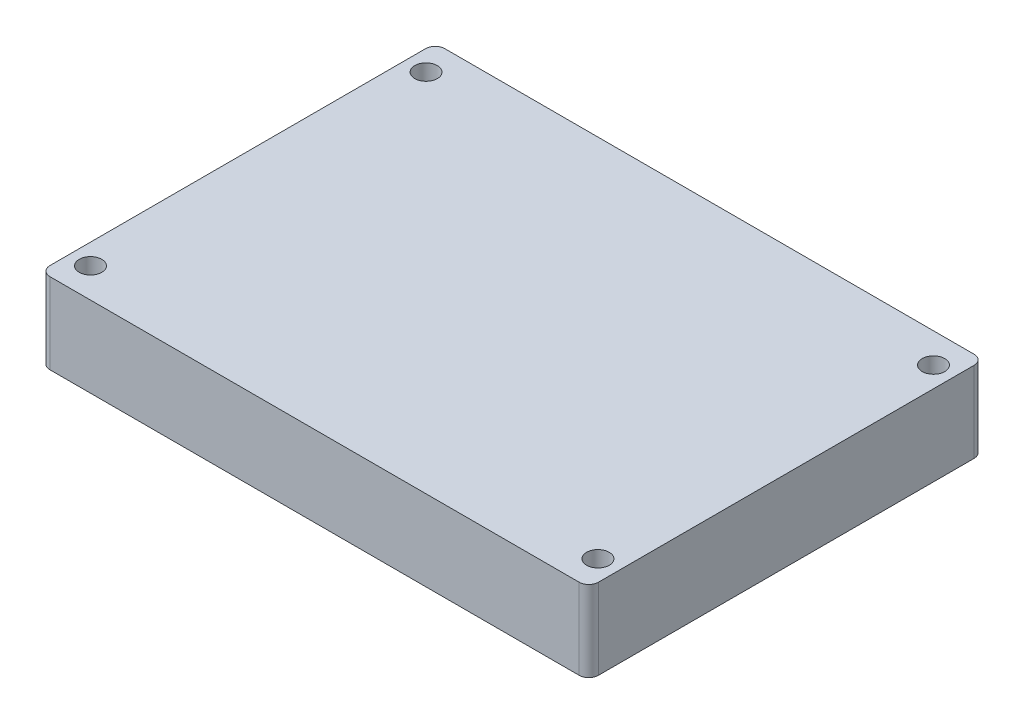
ISO-10303-21;
HEADER;
FILE_DESCRIPTION(('STEP AP214'),'2;1');
FILE_NAME('part.step','',(''),(''),'','','');
FILE_SCHEMA(('AUTOMOTIVE_DESIGN { 1 0 10303 214 1 1 1 1 }'));
ENDSEC;
DATA;
#1=APPLICATION_CONTEXT('core data for automotive mechanical design processes');
#2=APPLICATION_PROTOCOL_DEFINITION('international standard','automotive_design',2000,#1);
#3=PRODUCT_CONTEXT('',#1,'mechanical');
#4=PRODUCT('Part','Part','',(#3));
#5=PRODUCT_RELATED_PRODUCT_CATEGORY('part','',(#4));
#6=PRODUCT_DEFINITION_FORMATION('','',#4);
#7=PRODUCT_DEFINITION_CONTEXT('part definition',#1,'design');
#8=PRODUCT_DEFINITION('design','',#6,#7);
#9=PRODUCT_DEFINITION_SHAPE('','',#8);
#10=(LENGTH_UNIT() NAMED_UNIT(*) SI_UNIT(.MILLI.,.METRE.));
#11=(NAMED_UNIT(*) PLANE_ANGLE_UNIT() SI_UNIT($,.RADIAN.));
#12=(NAMED_UNIT(*) SI_UNIT($,.STERADIAN.) SOLID_ANGLE_UNIT());
#13=UNCERTAINTY_MEASURE_WITH_UNIT(LENGTH_MEASURE(1.E-05),#10,'distance_accuracy_value','');
#14=(GEOMETRIC_REPRESENTATION_CONTEXT(3) GLOBAL_UNCERTAINTY_ASSIGNED_CONTEXT((#13)) GLOBAL_UNIT_ASSIGNED_CONTEXT((#10,
#11,#12)) REPRESENTATION_CONTEXT('',''));
#15=CARTESIAN_POINT('',(0.,0.,0.));
#16=DIRECTION('',(0.,0.,1.));
#17=DIRECTION('',(1.,0.,0.));
#18=AXIS2_PLACEMENT_3D('',#15,#16,#17);
#19=CARTESIAN_POINT('',(41.,12.5,29.1));
#20=DIRECTION('',(0.,1.,0.));
#21=DIRECTION('',(0.,0.,1.));
#22=AXIS2_PLACEMENT_3D('',#19,#20,#21);
#23=PLANE('',#22);
#24=CARTESIAN_POINT('',(39.32,12.5,26.));
#25=DIRECTION('',(0.,1.,0.));
#26=DIRECTION('',(0.,0.,-1.));
#27=AXIS2_PLACEMENT_3D('',#24,#25,#26);
#28=CIRCLE('',#27,1.75);
#29=CARTESIAN_POINT('',(39.32,12.5,24.25));
#30=VERTEX_POINT('',#29);
#31=EDGE_CURVE('E189',#30,#30,#28,.T.);
#32=ORIENTED_EDGE('',*,*,#31,.F.);
#33=EDGE_LOOP('',(#32));
#34=FACE_BOUND('',#33,.T.);
#35=CARTESIAN_POINT('',(39.32,12.5,-26.));
#36=DIRECTION('',(0.,1.,0.));
#37=DIRECTION('',(0.,0.,1.));
#38=AXIS2_PLACEMENT_3D('',#35,#36,#37);
#39=CIRCLE('',#38,1.75);
#40=CARTESIAN_POINT('',(39.32,12.5,-24.25));
#41=VERTEX_POINT('',#40);
#42=EDGE_CURVE('E135',#41,#41,#39,.T.);
#43=ORIENTED_EDGE('',*,*,#42,.F.);
#44=EDGE_LOOP('',(#43));
#45=FACE_BOUND('',#44,.T.);
#46=CARTESIAN_POINT('',(41.,12.5,29.1));
#47=DIRECTION('',(0.,1.,0.));
#48=DIRECTION('',(0.,0.,1.));
#49=AXIS2_PLACEMENT_3D('',#46,#47,#48);
#50=CIRCLE('',#49,1.5);
#51=CARTESIAN_POINT('',(41.,12.5,30.6));
#52=VERTEX_POINT('',#51);
#53=CARTESIAN_POINT('',(42.5,12.5,29.1));
#54=VERTEX_POINT('',#53);
#55=EDGE_CURVE('E146',#52,#54,#50,.T.);
#56=ORIENTED_EDGE('',*,*,#55,.T.);
#57=DIRECTION('',(0.,0.,-1.));
#58=VECTOR('',#57,1.);
#59=CARTESIAN_POINT('',(42.5,12.5,29.1));
#60=LINE('',#59,#58);
#61=CARTESIAN_POINT('',(42.5,12.5,-29.1));
#62=VERTEX_POINT('',#61);
#63=EDGE_CURVE('E94',#54,#62,#60,.T.);
#64=ORIENTED_EDGE('',*,*,#63,.T.);
#65=CARTESIAN_POINT('',(41.,12.5,-29.1));
#66=DIRECTION('',(0.,1.,0.));
#67=DIRECTION('',(0.,0.,1.));
#68=AXIS2_PLACEMENT_3D('',#65,#66,#67);
#69=CIRCLE('',#68,1.5);
#70=CARTESIAN_POINT('',(41.,12.5,-30.6));
#71=VERTEX_POINT('',#70);
#72=EDGE_CURVE('E161',#62,#71,#69,.T.);
#73=ORIENTED_EDGE('',*,*,#72,.T.);
#74=DIRECTION('',(-1.,0.,0.));
#75=VECTOR('',#74,1.);
#76=CARTESIAN_POINT('',(41.,12.5,-30.6));
#77=LINE('',#76,#75);
#78=CARTESIAN_POINT('',(-41.,12.5,-30.6));
#79=VERTEX_POINT('',#78);
#80=EDGE_CURVE('E174',#71,#79,#77,.T.);
#81=ORIENTED_EDGE('',*,*,#80,.T.);
#82=CARTESIAN_POINT('',(-41.,12.5,-29.1));
#83=DIRECTION('',(0.,1.,0.));
#84=DIRECTION('',(0.,0.,1.));
#85=AXIS2_PLACEMENT_3D('',#82,#83,#84);
#86=CIRCLE('',#85,1.5);
#87=CARTESIAN_POINT('',(-42.5,12.5,-29.1));
#88=VERTEX_POINT('',#87);
#89=EDGE_CURVE('E113',#79,#88,#86,.T.);
#90=ORIENTED_EDGE('',*,*,#89,.T.);
#91=DIRECTION('',(0.,0.,1.));
#92=VECTOR('',#91,1.);
#93=CARTESIAN_POINT('',(-42.5,12.5,29.1));
#94=LINE('',#93,#92);
#95=CARTESIAN_POINT('',(-42.5,12.5,29.1));
#96=VERTEX_POINT('',#95);
#97=EDGE_CURVE('E107',#88,#96,#94,.T.);
#98=ORIENTED_EDGE('',*,*,#97,.T.);
#99=CARTESIAN_POINT('',(-41.,12.5,29.1));
#100=DIRECTION('',(0.,1.,0.));
#101=DIRECTION('',(0.,0.,-1.));
#102=AXIS2_PLACEMENT_3D('',#99,#100,#101);
#103=CIRCLE('',#102,1.5);
#104=CARTESIAN_POINT('',(-41.,12.5,30.6));
#105=VERTEX_POINT('',#104);
#106=EDGE_CURVE('E111',#96,#105,#103,.T.);
#107=ORIENTED_EDGE('',*,*,#106,.T.);
#108=DIRECTION('',(1.,0.,0.));
#109=VECTOR('',#108,1.);
#110=CARTESIAN_POINT('',(41.,12.5,30.6));
#111=LINE('',#110,#109);
#112=EDGE_CURVE('E51',#105,#52,#111,.T.);
#113=ORIENTED_EDGE('',*,*,#112,.T.);
#114=EDGE_LOOP('',(#56,#64,#73,#81,#90,#98,#107,#113));
#115=FACE_BOUND('',#114,.T.);
#116=CARTESIAN_POINT('',(-39.32,12.5,26.));
#117=DIRECTION('',(0.,1.,0.));
#118=DIRECTION('',(0.,0.,1.));
#119=AXIS2_PLACEMENT_3D('',#116,#117,#118);
#120=CIRCLE('',#119,1.75);
#121=CARTESIAN_POINT('',(-39.32,12.5,27.75));
#122=VERTEX_POINT('',#121);
#123=EDGE_CURVE('E183',#122,#122,#120,.T.);
#124=ORIENTED_EDGE('',*,*,#123,.F.);
#125=EDGE_LOOP('',(#124));
#126=FACE_BOUND('',#125,.T.);
#127=CARTESIAN_POINT('',(-39.32,12.5,-26.));
#128=DIRECTION('',(0.,1.,0.));
#129=DIRECTION('',(0.,0.,-1.));
#130=AXIS2_PLACEMENT_3D('',#127,#128,#129);
#131=CIRCLE('',#130,1.75);
#132=CARTESIAN_POINT('',(-39.32,12.5,-27.75));
#133=VERTEX_POINT('',#132);
#134=EDGE_CURVE('E195',#133,#133,#131,.T.);
#135=ORIENTED_EDGE('',*,*,#134,.F.);
#136=EDGE_LOOP('',(#135));
#137=FACE_BOUND('',#136,.T.);
#138=ADVANCED_FACE('F34',(#34,#45,#115,#126,#137),#23,.T.);
#139=CARTESIAN_POINT('',(41.,0.,29.1));
#140=DIRECTION('',(0.,1.,0.));
#141=DIRECTION('',(0.,0.,1.));
#142=AXIS2_PLACEMENT_3D('',#139,#140,#141);
#143=PLANE('',#142);
#144=CARTESIAN_POINT('',(41.,0.,29.1));
#145=DIRECTION('',(0.,1.,0.));
#146=DIRECTION('',(0.,0.,1.));
#147=AXIS2_PLACEMENT_3D('',#144,#145,#146);
#148=CIRCLE('',#147,1.5);
#149=CARTESIAN_POINT('',(41.,0.,30.6));
#150=VERTEX_POINT('',#149);
#151=CARTESIAN_POINT('',(42.5,0.,29.1));
#152=VERTEX_POINT('',#151);
#153=EDGE_CURVE('E131',#150,#152,#148,.T.);
#154=ORIENTED_EDGE('',*,*,#153,.F.);
#155=DIRECTION('',(1.,0.,0.));
#156=VECTOR('',#155,1.);
#157=CARTESIAN_POINT('',(41.,0.,30.6));
#158=LINE('',#157,#156);
#159=CARTESIAN_POINT('',(-41.,0.,30.6));
#160=VERTEX_POINT('',#159);
#161=EDGE_CURVE('E86',#160,#150,#158,.T.);
#162=ORIENTED_EDGE('',*,*,#161,.F.);
#163=CARTESIAN_POINT('',(-41.,0.,29.1));
#164=DIRECTION('',(0.,1.,0.));
#165=DIRECTION('',(0.,0.,-1.));
#166=AXIS2_PLACEMENT_3D('',#163,#164,#165);
#167=CIRCLE('',#166,1.5);
#168=CARTESIAN_POINT('',(-42.5,0.,29.1));
#169=VERTEX_POINT('',#168);
#170=EDGE_CURVE('E80',#169,#160,#167,.T.);
#171=ORIENTED_EDGE('',*,*,#170,.F.);
#172=DIRECTION('',(0.,0.,1.));
#173=VECTOR('',#172,1.);
#174=CARTESIAN_POINT('',(-42.5,0.,29.1));
#175=LINE('',#174,#173);
#176=CARTESIAN_POINT('',(-42.5,0.,-29.1));
#177=VERTEX_POINT('',#176);
#178=EDGE_CURVE('E121',#177,#169,#175,.T.);
#179=ORIENTED_EDGE('',*,*,#178,.F.);
#180=CARTESIAN_POINT('',(-41.,0.,-29.1));
#181=DIRECTION('',(0.,1.,0.));
#182=DIRECTION('',(0.,0.,1.));
#183=AXIS2_PLACEMENT_3D('',#180,#181,#182);
#184=CIRCLE('',#183,1.5);
#185=CARTESIAN_POINT('',(-41.,0.,-30.6));
#186=VERTEX_POINT('',#185);
#187=EDGE_CURVE('E141',#186,#177,#184,.T.);
#188=ORIENTED_EDGE('',*,*,#187,.F.);
#189=DIRECTION('',(-1.,0.,0.));
#190=VECTOR('',#189,1.);
#191=CARTESIAN_POINT('',(41.,0.,-30.6));
#192=LINE('',#191,#190);
#193=CARTESIAN_POINT('',(41.,0.,-30.6));
#194=VERTEX_POINT('',#193);
#195=EDGE_CURVE('E139',#194,#186,#192,.T.);
#196=ORIENTED_EDGE('',*,*,#195,.F.);
#197=CARTESIAN_POINT('',(41.,0.,-29.1));
#198=DIRECTION('',(0.,1.,0.));
#199=DIRECTION('',(0.,0.,1.));
#200=AXIS2_PLACEMENT_3D('',#197,#198,#199);
#201=CIRCLE('',#200,1.5);
#202=CARTESIAN_POINT('',(42.5,0.,-29.1));
#203=VERTEX_POINT('',#202);
#204=EDGE_CURVE('E137',#203,#194,#201,.T.);
#205=ORIENTED_EDGE('',*,*,#204,.F.);
#206=DIRECTION('',(0.,0.,-1.));
#207=VECTOR('',#206,1.);
#208=CARTESIAN_POINT('',(42.5,0.,29.1));
#209=LINE('',#208,#207);
#210=EDGE_CURVE('E134',#152,#203,#209,.T.);
#211=ORIENTED_EDGE('',*,*,#210,.F.);
#212=EDGE_LOOP('',(#154,#162,#171,#179,#188,#196,#205,#211));
#213=FACE_BOUND('',#212,.T.);
#214=CARTESIAN_POINT('',(39.32,0.,-26.));
#215=DIRECTION('',(0.,1.,0.));
#216=DIRECTION('',(0.,0.,1.));
#217=AXIS2_PLACEMENT_3D('',#214,#215,#216);
#218=CIRCLE('',#217,1.75);
#219=CARTESIAN_POINT('',(39.32,0.,-24.25));
#220=VERTEX_POINT('',#219);
#221=EDGE_CURVE('E180',#220,#220,#218,.T.);
#222=ORIENTED_EDGE('',*,*,#221,.T.);
#223=EDGE_LOOP('',(#222));
#224=FACE_BOUND('',#223,.T.);
#225=CARTESIAN_POINT('',(-39.32,0.,26.));
#226=DIRECTION('',(0.,1.,0.));
#227=DIRECTION('',(0.,0.,1.));
#228=AXIS2_PLACEMENT_3D('',#225,#226,#227);
#229=CIRCLE('',#228,1.75);
#230=CARTESIAN_POINT('',(-39.32,0.,27.75));
#231=VERTEX_POINT('',#230);
#232=EDGE_CURVE('E186',#231,#231,#229,.T.);
#233=ORIENTED_EDGE('',*,*,#232,.T.);
#234=EDGE_LOOP('',(#233));
#235=FACE_BOUND('',#234,.T.);
#236=CARTESIAN_POINT('',(39.32,0.,26.));
#237=DIRECTION('',(0.,1.,0.));
#238=DIRECTION('',(0.,0.,-1.));
#239=AXIS2_PLACEMENT_3D('',#236,#237,#238);
#240=CIRCLE('',#239,1.75);
#241=CARTESIAN_POINT('',(39.32,0.,24.25));
#242=VERTEX_POINT('',#241);
#243=EDGE_CURVE('E192',#242,#242,#240,.T.);
#244=ORIENTED_EDGE('',*,*,#243,.T.);
#245=EDGE_LOOP('',(#244));
#246=FACE_BOUND('',#245,.T.);
#247=CARTESIAN_POINT('',(-39.32,0.,-26.));
#248=DIRECTION('',(0.,1.,0.));
#249=DIRECTION('',(0.,0.,-1.));
#250=AXIS2_PLACEMENT_3D('',#247,#248,#249);
#251=CIRCLE('',#250,1.75);
#252=CARTESIAN_POINT('',(-39.32,0.,-27.75));
#253=VERTEX_POINT('',#252);
#254=EDGE_CURVE('E198',#253,#253,#251,.T.);
#255=ORIENTED_EDGE('',*,*,#254,.T.);
#256=EDGE_LOOP('',(#255));
#257=FACE_BOUND('',#256,.T.);
#258=ADVANCED_FACE('F165',(#213,#224,#235,#246,#257),#143,.F.);
#259=CARTESIAN_POINT('',(41.,12.5,29.1));
#260=DIRECTION('',(0.,-1.,0.));
#261=DIRECTION('',(0.,0.,-1.));
#262=AXIS2_PLACEMENT_3D('',#259,#260,#261);
#263=CYLINDRICAL_SURFACE('',#262,1.5);
#264=ORIENTED_EDGE('',*,*,#153,.T.);
#265=DIRECTION('',(0.,-1.,0.));
#266=VECTOR('',#265,1.);
#267=CARTESIAN_POINT('',(42.5,12.5,29.1));
#268=LINE('',#267,#266);
#269=EDGE_CURVE('E11',#54,#152,#268,.T.);
#270=ORIENTED_EDGE('',*,*,#269,.F.);
#271=ORIENTED_EDGE('',*,*,#55,.F.);
#272=DIRECTION('',(0.,-1.,0.));
#273=VECTOR('',#272,1.);
#274=CARTESIAN_POINT('',(41.,12.5,30.6));
#275=LINE('',#274,#273);
#276=EDGE_CURVE('E127',#52,#150,#275,.T.);
#277=ORIENTED_EDGE('',*,*,#276,.T.);
#278=EDGE_LOOP('',(#264,#270,#271,#277));
#279=FACE_BOUND('',#278,.T.);
#280=ADVANCED_FACE('F36',(#279),#263,.T.);
#281=CARTESIAN_POINT('',(42.5,12.5,29.1));
#282=DIRECTION('',(-1.,0.,0.));
#283=DIRECTION('',(0.,0.,1.));
#284=AXIS2_PLACEMENT_3D('',#281,#282,#283);
#285=PLANE('',#284);
#286=ORIENTED_EDGE('',*,*,#210,.T.);
#287=DIRECTION('',(0.,-1.,0.));
#288=VECTOR('',#287,1.);
#289=CARTESIAN_POINT('',(42.5,12.5,-29.1));
#290=LINE('',#289,#288);
#291=EDGE_CURVE('E43',#62,#203,#290,.T.);
#292=ORIENTED_EDGE('',*,*,#291,.F.);
#293=ORIENTED_EDGE('',*,*,#63,.F.);
#294=ORIENTED_EDGE('',*,*,#269,.T.);
#295=EDGE_LOOP('',(#286,#292,#293,#294));
#296=FACE_BOUND('',#295,.T.);
#297=ADVANCED_FACE('F232',(#296),#285,.F.);
#298=CARTESIAN_POINT('',(41.,12.5,-29.1));
#299=DIRECTION('',(0.,-1.,0.));
#300=DIRECTION('',(0.,0.,-1.));
#301=AXIS2_PLACEMENT_3D('',#298,#299,#300);
#302=CYLINDRICAL_SURFACE('',#301,1.5);
#303=ORIENTED_EDGE('',*,*,#204,.T.);
#304=DIRECTION('',(0.,-1.,0.));
#305=VECTOR('',#304,1.);
#306=CARTESIAN_POINT('',(41.,12.5,-30.6));
#307=LINE('',#306,#305);
#308=EDGE_CURVE('E153',#71,#194,#307,.T.);
#309=ORIENTED_EDGE('',*,*,#308,.F.);
#310=ORIENTED_EDGE('',*,*,#72,.F.);
#311=ORIENTED_EDGE('',*,*,#291,.T.);
#312=EDGE_LOOP('',(#303,#309,#310,#311));
#313=FACE_BOUND('',#312,.T.);
#314=ADVANCED_FACE('F159',(#313),#302,.T.);
#315=CARTESIAN_POINT('',(41.,12.5,-30.6));
#316=DIRECTION('',(0.,0.,1.));
#317=DIRECTION('',(1.,0.,0.));
#318=AXIS2_PLACEMENT_3D('',#315,#316,#317);
#319=PLANE('',#318);
#320=ORIENTED_EDGE('',*,*,#195,.T.);
#321=DIRECTION('',(0.,-1.,0.));
#322=VECTOR('',#321,1.);
#323=CARTESIAN_POINT('',(-41.,12.5,-30.6));
#324=LINE('',#323,#322);
#325=EDGE_CURVE('E150',#79,#186,#324,.T.);
#326=ORIENTED_EDGE('',*,*,#325,.F.);
#327=ORIENTED_EDGE('',*,*,#80,.F.);
#328=ORIENTED_EDGE('',*,*,#308,.T.);
#329=EDGE_LOOP('',(#320,#326,#327,#328));
#330=FACE_BOUND('',#329,.T.);
#331=ADVANCED_FACE('F170',(#330),#319,.F.);
#332=CARTESIAN_POINT('',(-41.,12.5,-29.1));
#333=DIRECTION('',(0.,-1.,0.));
#334=DIRECTION('',(0.,0.,-1.));
#335=AXIS2_PLACEMENT_3D('',#332,#333,#334);
#336=CYLINDRICAL_SURFACE('',#335,1.5);
#337=ORIENTED_EDGE('',*,*,#187,.T.);
#338=DIRECTION('',(0.,-1.,0.));
#339=VECTOR('',#338,1.);
#340=CARTESIAN_POINT('',(-42.5,12.5,-29.1));
#341=LINE('',#340,#339);
#342=EDGE_CURVE('E122',#88,#177,#341,.T.);
#343=ORIENTED_EDGE('',*,*,#342,.F.);
#344=ORIENTED_EDGE('',*,*,#89,.F.);
#345=ORIENTED_EDGE('',*,*,#325,.T.);
#346=EDGE_LOOP('',(#337,#343,#344,#345));
#347=FACE_BOUND('',#346,.T.);
#348=ADVANCED_FACE('F173',(#347),#336,.T.);
#349=CARTESIAN_POINT('',(-42.5,12.5,29.1));
#350=DIRECTION('',(1.,0.,0.));
#351=DIRECTION('',(0.,0.,-1.));
#352=AXIS2_PLACEMENT_3D('',#349,#350,#351);
#353=PLANE('',#352);
#354=ORIENTED_EDGE('',*,*,#178,.T.);
#355=DIRECTION('',(0.,-1.,0.));
#356=VECTOR('',#355,1.);
#357=CARTESIAN_POINT('',(-42.5,12.5,29.1));
#358=LINE('',#357,#356);
#359=EDGE_CURVE('E118',#96,#169,#358,.T.);
#360=ORIENTED_EDGE('',*,*,#359,.F.);
#361=ORIENTED_EDGE('',*,*,#97,.F.);
#362=ORIENTED_EDGE('',*,*,#342,.T.);
#363=EDGE_LOOP('',(#354,#360,#361,#362));
#364=FACE_BOUND('',#363,.T.);
#365=ADVANCED_FACE('F119',(#364),#353,.F.);
#366=CARTESIAN_POINT('',(-41.,12.5,29.1));
#367=DIRECTION('',(0.,-1.,0.));
#368=DIRECTION('',(0.,0.,-1.));
#369=AXIS2_PLACEMENT_3D('',#366,#367,#368);
#370=CYLINDRICAL_SURFACE('',#369,1.5);
#371=ORIENTED_EDGE('',*,*,#170,.T.);
#372=DIRECTION('',(0.,-1.,0.));
#373=VECTOR('',#372,1.);
#374=CARTESIAN_POINT('',(-41.,12.5,30.6));
#375=LINE('',#374,#373);
#376=EDGE_CURVE('E123',#105,#160,#375,.T.);
#377=ORIENTED_EDGE('',*,*,#376,.F.);
#378=ORIENTED_EDGE('',*,*,#106,.F.);
#379=ORIENTED_EDGE('',*,*,#359,.T.);
#380=EDGE_LOOP('',(#371,#377,#378,#379));
#381=FACE_BOUND('',#380,.T.);
#382=ADVANCED_FACE('F125',(#381),#370,.T.);
#383=CARTESIAN_POINT('',(41.,12.5,30.6));
#384=DIRECTION('',(0.,0.,-1.));
#385=DIRECTION('',(-1.,0.,0.));
#386=AXIS2_PLACEMENT_3D('',#383,#384,#385);
#387=PLANE('',#386);
#388=ORIENTED_EDGE('',*,*,#161,.T.);
#389=ORIENTED_EDGE('',*,*,#276,.F.);
#390=ORIENTED_EDGE('',*,*,#112,.F.);
#391=ORIENTED_EDGE('',*,*,#376,.T.);
#392=EDGE_LOOP('',(#388,#389,#390,#391));
#393=FACE_BOUND('',#392,.T.);
#394=ADVANCED_FACE('F220',(#393),#387,.F.);
#395=CARTESIAN_POINT('',(39.32,12.5,-26.));
#396=DIRECTION('',(0.,-1.,0.));
#397=DIRECTION('',(0.,0.,-1.));
#398=AXIS2_PLACEMENT_3D('',#395,#396,#397);
#399=CYLINDRICAL_SURFACE('',#398,1.75);
#400=ORIENTED_EDGE('',*,*,#42,.T.);
#401=EDGE_LOOP('',(#400));
#402=FACE_BOUND('',#401,.T.);
#403=ORIENTED_EDGE('',*,*,#221,.F.);
#404=EDGE_LOOP('',(#403));
#405=FACE_BOUND('',#404,.T.);
#406=ADVANCED_FACE('F217',(#402,#405),#399,.F.);
#407=CARTESIAN_POINT('',(-39.32,12.5,26.));
#408=DIRECTION('',(0.,-1.,0.));
#409=DIRECTION('',(0.,0.,-1.));
#410=AXIS2_PLACEMENT_3D('',#407,#408,#409);
#411=CYLINDRICAL_SURFACE('',#410,1.75);
#412=ORIENTED_EDGE('',*,*,#123,.T.);
#413=EDGE_LOOP('',(#412));
#414=FACE_BOUND('',#413,.T.);
#415=ORIENTED_EDGE('',*,*,#232,.F.);
#416=EDGE_LOOP('',(#415));
#417=FACE_BOUND('',#416,.T.);
#418=ADVANCED_FACE('F296',(#414,#417),#411,.F.);
#419=CARTESIAN_POINT('',(39.32,12.5,26.));
#420=DIRECTION('',(0.,-1.,0.));
#421=DIRECTION('',(0.,0.,-1.));
#422=AXIS2_PLACEMENT_3D('',#419,#420,#421);
#423=CYLINDRICAL_SURFACE('',#422,1.75);
#424=ORIENTED_EDGE('',*,*,#31,.T.);
#425=EDGE_LOOP('',(#424));
#426=FACE_BOUND('',#425,.T.);
#427=ORIENTED_EDGE('',*,*,#243,.F.);
#428=EDGE_LOOP('',(#427));
#429=FACE_BOUND('',#428,.T.);
#430=ADVANCED_FACE('F304',(#426,#429),#423,.F.);
#431=CARTESIAN_POINT('',(-39.32,12.5,-26.));
#432=DIRECTION('',(0.,-1.,0.));
#433=DIRECTION('',(0.,0.,-1.));
#434=AXIS2_PLACEMENT_3D('',#431,#432,#433);
#435=CYLINDRICAL_SURFACE('',#434,1.75);
#436=ORIENTED_EDGE('',*,*,#134,.T.);
#437=EDGE_LOOP('',(#436));
#438=FACE_BOUND('',#437,.T.);
#439=ORIENTED_EDGE('',*,*,#254,.F.);
#440=EDGE_LOOP('',(#439));
#441=FACE_BOUND('',#440,.T.);
#442=ADVANCED_FACE('F204',(#438,#441),#435,.F.);
#443=CLOSED_SHELL('',(#138,#258,#280,#297,#314,#331,#348,#365,#382,#394,#406,#418,#430,#442));
#444=MANIFOLD_SOLID_BREP('B2',#443);
#445=ADVANCED_BREP_SHAPE_REPRESENTATION('',(#18,#444),#14);
#446=SHAPE_DEFINITION_REPRESENTATION(#9,#445);
ENDSEC;
END-ISO-10303-21;
